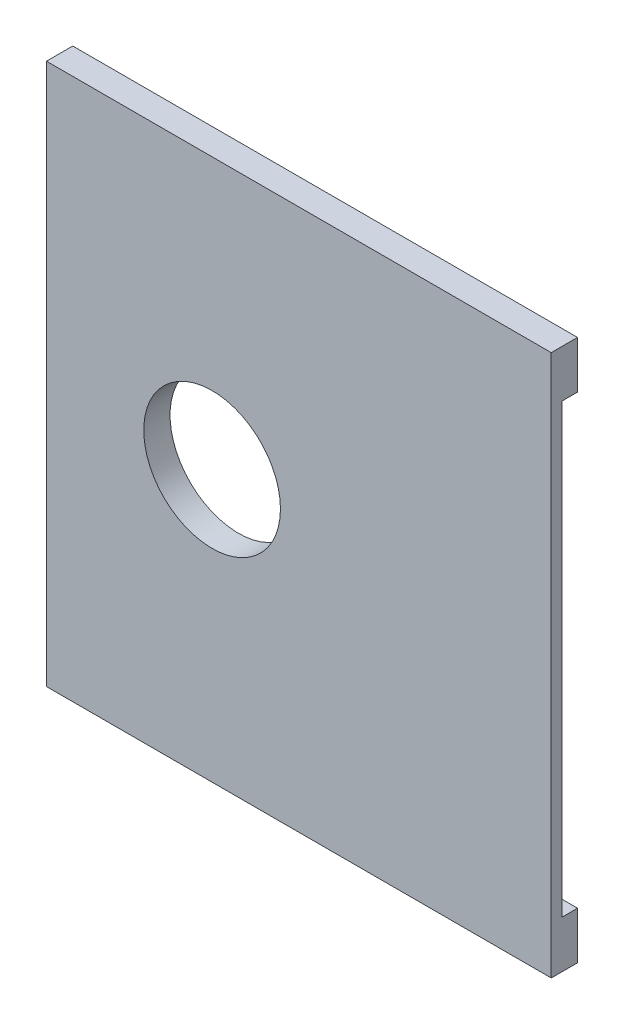
ISO-10303-21;
HEADER;
FILE_DESCRIPTION(('STEP AP214'),'2;1');
FILE_NAME('part.step','',(''),(''),'','','');
FILE_SCHEMA(('AUTOMOTIVE_DESIGN { 1 0 10303 214 1 1 1 1 }'));
ENDSEC;
DATA;
#1=APPLICATION_CONTEXT('core data for automotive mechanical design processes');
#2=APPLICATION_PROTOCOL_DEFINITION('international standard','automotive_design',2000,#1);
#3=PRODUCT_CONTEXT('',#1,'mechanical');
#4=PRODUCT('Part','Part','',(#3));
#5=PRODUCT_RELATED_PRODUCT_CATEGORY('part','',(#4));
#6=PRODUCT_DEFINITION_FORMATION('','',#4);
#7=PRODUCT_DEFINITION_CONTEXT('part definition',#1,'design');
#8=PRODUCT_DEFINITION('design','',#6,#7);
#9=PRODUCT_DEFINITION_SHAPE('','',#8);
#10=(LENGTH_UNIT() NAMED_UNIT(*) SI_UNIT(.MILLI.,.METRE.));
#11=(NAMED_UNIT(*) PLANE_ANGLE_UNIT() SI_UNIT($,.RADIAN.));
#12=(NAMED_UNIT(*) SI_UNIT($,.STERADIAN.) SOLID_ANGLE_UNIT());
#13=UNCERTAINTY_MEASURE_WITH_UNIT(LENGTH_MEASURE(1.E-05),#10,'distance_accuracy_value','');
#14=(GEOMETRIC_REPRESENTATION_CONTEXT(3) GLOBAL_UNCERTAINTY_ASSIGNED_CONTEXT((#13)) GLOBAL_UNIT_ASSIGNED_CONTEXT((#10,
#11,#12)) REPRESENTATION_CONTEXT('',''));
#15=CARTESIAN_POINT('',(0.,0.,0.));
#16=DIRECTION('',(0.,0.,1.));
#17=DIRECTION('',(1.,0.,0.));
#18=AXIS2_PLACEMENT_3D('',#15,#16,#17);
#19=CARTESIAN_POINT('',(0.,0.,0.));
#20=DIRECTION('',(0.,0.,1.));
#21=DIRECTION('',(1.,0.,0.));
#22=AXIS2_PLACEMENT_3D('',#19,#20,#21);
#23=PLANE('',#22);
#24=CARTESIAN_POINT('',(0.,0.,0.));
#25=DIRECTION('',(0.,0.,1.));
#26=DIRECTION('',(1.,0.,0.));
#27=AXIS2_PLACEMENT_3D('',#24,#25,#26);
#28=CIRCLE('',#27,2.6);
#29=CARTESIAN_POINT('',(2.6,0.,0.));
#30=VERTEX_POINT('',#29);
#31=EDGE_CURVE('E125',#30,#30,#28,.T.);
#32=ORIENTED_EDGE('',*,*,#31,.T.);
#33=EDGE_LOOP('',(#32));
#34=FACE_BOUND('',#33,.T.);
#35=DIRECTION('',(1.,0.,0.));
#36=VECTOR('',#35,1.);
#37=CARTESIAN_POINT('',(12.9,-8.49999999999999,0.));
#38=LINE('',#37,#36);
#39=CARTESIAN_POINT('',(5.30000000000001,-8.49999999999999,0.));
#40=VERTEX_POINT('',#39);
#41=CARTESIAN_POINT('',(12.9,-8.49999999999999,0.));
#42=VERTEX_POINT('',#41);
#43=EDGE_CURVE('E170',#40,#42,#38,.T.);
#44=ORIENTED_EDGE('',*,*,#43,.T.);
#45=DIRECTION('',(0.,1.,0.));
#46=VECTOR('',#45,1.);
#47=CARTESIAN_POINT('',(12.9,-10.3,0.));
#48=LINE('',#47,#46);
#49=CARTESIAN_POINT('',(12.9,-10.3,0.));
#50=VERTEX_POINT('',#49);
#51=EDGE_CURVE('E151',#50,#42,#48,.T.);
#52=ORIENTED_EDGE('',*,*,#51,.F.);
#53=DIRECTION('',(1.,0.,0.));
#54=VECTOR('',#53,1.);
#55=CARTESIAN_POINT('',(8.1,-10.3,0.));
#56=LINE('',#55,#54);
#57=CARTESIAN_POINT('',(-6.3,-10.3,0.));
#58=VERTEX_POINT('',#57);
#59=EDGE_CURVE('E149',#58,#50,#56,.T.);
#60=ORIENTED_EDGE('',*,*,#59,.F.);
#61=DIRECTION('',(0.,-1.,0.));
#62=VECTOR('',#61,1.);
#63=CARTESIAN_POINT('',(-6.3,10.3,0.));
#64=LINE('',#63,#62);
#65=CARTESIAN_POINT('',(-6.3,10.3,0.));
#66=VERTEX_POINT('',#65);
#67=EDGE_CURVE('E136',#66,#58,#64,.T.);
#68=ORIENTED_EDGE('',*,*,#67,.F.);
#69=DIRECTION('',(-1.,0.,0.));
#70=VECTOR('',#69,1.);
#71=CARTESIAN_POINT('',(6.30000000000001,10.3,0.));
#72=LINE('',#71,#70);
#73=CARTESIAN_POINT('',(12.9,10.3,0.));
#74=VERTEX_POINT('',#73);
#75=EDGE_CURVE('E140',#74,#66,#72,.T.);
#76=ORIENTED_EDGE('',*,*,#75,.F.);
#77=CARTESIAN_POINT('',(12.9,8.5,0.));
#78=VERTEX_POINT('',#77);
#79=EDGE_CURVE('E79',#78,#74,#48,.T.);
#80=ORIENTED_EDGE('',*,*,#79,.F.);
#81=DIRECTION('',(-1.,0.,0.));
#82=VECTOR('',#81,1.);
#83=CARTESIAN_POINT('',(6.30000000000001,8.49999999999999,0.));
#84=LINE('',#83,#82);
#85=CARTESIAN_POINT('',(5.30000000000001,8.49999999999999,0.));
#86=VERTEX_POINT('',#85);
#87=EDGE_CURVE('E120',#78,#86,#84,.T.);
#88=ORIENTED_EDGE('',*,*,#87,.T.);
#89=DIRECTION('',(0.,-1.,0.));
#90=VECTOR('',#89,1.);
#91=CARTESIAN_POINT('',(5.30000000000001,8.49999999999999,0.));
#92=LINE('',#91,#90);
#93=EDGE_CURVE('E124',#86,#40,#92,.T.);
#94=ORIENTED_EDGE('',*,*,#93,.T.);
#95=EDGE_LOOP('',(#44,#52,#60,#68,#76,#80,#88,#94));
#96=FACE_BOUND('',#95,.T.);
#97=ADVANCED_FACE('F33',(#34,#96),#23,.F.);
#98=CARTESIAN_POINT('',(12.9,-10.3,1.));
#99=DIRECTION('',(-1.,0.,0.));
#100=DIRECTION('',(0.,0.,1.));
#101=AXIS2_PLACEMENT_3D('',#98,#99,#100);
#102=PLANE('',#101);
#103=DIRECTION('',(0.,0.,-1.));
#104=VECTOR('',#103,1.);
#105=CARTESIAN_POINT('',(12.9,-8.49999999999999,0.6));
#106=LINE('',#105,#104);
#107=CARTESIAN_POINT('',(12.9,-8.49999999999999,0.6));
#108=VERTEX_POINT('',#107);
#109=EDGE_CURVE('E131',#108,#42,#106,.T.);
#110=ORIENTED_EDGE('',*,*,#109,.F.);
#111=DIRECTION('',(0.,1.,0.));
#112=VECTOR('',#111,1.);
#113=CARTESIAN_POINT('',(12.9,8.5,0.6));
#114=LINE('',#113,#112);
#115=CARTESIAN_POINT('',(12.9,8.49999999999999,0.6));
#116=VERTEX_POINT('',#115);
#117=EDGE_CURVE('E260',#108,#116,#114,.T.);
#118=ORIENTED_EDGE('',*,*,#117,.T.);
#119=DIRECTION('',(0.,0.,-1.));
#120=VECTOR('',#119,1.);
#121=CARTESIAN_POINT('',(12.9,8.5,0.6));
#122=LINE('',#121,#120);
#123=EDGE_CURVE('E48',#116,#78,#122,.T.);
#124=ORIENTED_EDGE('',*,*,#123,.T.);
#125=ORIENTED_EDGE('',*,*,#79,.T.);
#126=DIRECTION('',(0.,0.,-1.));
#127=VECTOR('',#126,1.);
#128=CARTESIAN_POINT('',(12.9,10.3,1.));
#129=LINE('',#128,#127);
#130=CARTESIAN_POINT('',(12.9,10.3,1.));
#131=VERTEX_POINT('',#130);
#132=EDGE_CURVE('E146',#131,#74,#129,.T.);
#133=ORIENTED_EDGE('',*,*,#132,.F.);
#134=DIRECTION('',(0.,1.,0.));
#135=VECTOR('',#134,1.);
#136=CARTESIAN_POINT('',(12.9,-10.3,1.));
#137=LINE('',#136,#135);
#138=CARTESIAN_POINT('',(12.9,-10.3,1.));
#139=VERTEX_POINT('',#138);
#140=EDGE_CURVE('E144',#139,#131,#137,.T.);
#141=ORIENTED_EDGE('',*,*,#140,.F.);
#142=DIRECTION('',(0.,0.,-1.));
#143=VECTOR('',#142,1.);
#144=CARTESIAN_POINT('',(12.9,-10.3,1.));
#145=LINE('',#144,#143);
#146=EDGE_CURVE('E156',#139,#50,#145,.T.);
#147=ORIENTED_EDGE('',*,*,#146,.T.);
#148=ORIENTED_EDGE('',*,*,#51,.T.);
#149=EDGE_LOOP('',(#110,#118,#124,#125,#133,#141,#147,#148));
#150=FACE_BOUND('',#149,.T.);
#151=ADVANCED_FACE('F172',(#150),#102,.F.);
#152=CARTESIAN_POINT('',(0.,0.,1.));
#153=DIRECTION('',(0.,0.,1.));
#154=DIRECTION('',(1.,0.,0.));
#155=AXIS2_PLACEMENT_3D('',#152,#153,#154);
#156=PLANE('',#155);
#157=DIRECTION('',(-1.,0.,0.));
#158=VECTOR('',#157,1.);
#159=CARTESIAN_POINT('',(-5.30000000000001,10.3,1.));
#160=LINE('',#159,#158);
#161=CARTESIAN_POINT('',(-6.3,10.3,1.));
#162=VERTEX_POINT('',#161);
#163=EDGE_CURVE('E57',#131,#162,#160,.T.);
#164=ORIENTED_EDGE('',*,*,#163,.T.);
#165=DIRECTION('',(0.,-1.,0.));
#166=VECTOR('',#165,1.);
#167=CARTESIAN_POINT('',(-6.3,10.3,1.));
#168=LINE('',#167,#166);
#169=CARTESIAN_POINT('',(-6.3,-10.3,1.));
#170=VERTEX_POINT('',#169);
#171=EDGE_CURVE('E139',#162,#170,#168,.T.);
#172=ORIENTED_EDGE('',*,*,#171,.T.);
#173=DIRECTION('',(1.,0.,0.));
#174=VECTOR('',#173,1.);
#175=CARTESIAN_POINT('',(-6.3,-10.3,1.));
#176=LINE('',#175,#174);
#177=EDGE_CURVE('E142',#170,#139,#176,.T.);
#178=ORIENTED_EDGE('',*,*,#177,.T.);
#179=ORIENTED_EDGE('',*,*,#140,.T.);
#180=EDGE_LOOP('',(#164,#172,#178,#179));
#181=FACE_BOUND('',#180,.T.);
#182=CARTESIAN_POINT('',(0.,0.,1.));
#183=DIRECTION('',(0.,0.,1.));
#184=DIRECTION('',(1.,0.,0.));
#185=AXIS2_PLACEMENT_3D('',#182,#183,#184);
#186=CIRCLE('',#185,2.6);
#187=CARTESIAN_POINT('',(2.6,0.,1.));
#188=VERTEX_POINT('',#187);
#189=EDGE_CURVE('E129',#188,#188,#186,.T.);
#190=ORIENTED_EDGE('',*,*,#189,.F.);
#191=EDGE_LOOP('',(#190));
#192=FACE_BOUND('',#191,.T.);
#193=ADVANCED_FACE('F174',(#181,#192),#156,.T.);
#194=CARTESIAN_POINT('',(-6.3,10.3,1.));
#195=DIRECTION('',(1.,0.,0.));
#196=DIRECTION('',(0.,1.,0.));
#197=AXIS2_PLACEMENT_3D('',#194,#195,#196);
#198=PLANE('',#197);
#199=ORIENTED_EDGE('',*,*,#67,.T.);
#200=DIRECTION('',(0.,0.,-1.));
#201=VECTOR('',#200,1.);
#202=CARTESIAN_POINT('',(-6.3,-10.3,1.));
#203=LINE('',#202,#201);
#204=EDGE_CURVE('E41',#170,#58,#203,.T.);
#205=ORIENTED_EDGE('',*,*,#204,.F.);
#206=ORIENTED_EDGE('',*,*,#171,.F.);
#207=DIRECTION('',(0.,0.,-1.));
#208=VECTOR('',#207,1.);
#209=CARTESIAN_POINT('',(-6.3,10.3,1.));
#210=LINE('',#209,#208);
#211=EDGE_CURVE('E11',#162,#66,#210,.T.);
#212=ORIENTED_EDGE('',*,*,#211,.T.);
#213=EDGE_LOOP('',(#199,#205,#206,#212));
#214=FACE_BOUND('',#213,.T.);
#215=ADVANCED_FACE('F35',(#214),#198,.F.);
#216=CARTESIAN_POINT('',(8.1,-10.3,1.));
#217=DIRECTION('',(0.,1.,0.));
#218=DIRECTION('',(0.,0.,1.));
#219=AXIS2_PLACEMENT_3D('',#216,#217,#218);
#220=PLANE('',#219);
#221=ORIENTED_EDGE('',*,*,#59,.T.);
#222=ORIENTED_EDGE('',*,*,#146,.F.);
#223=ORIENTED_EDGE('',*,*,#177,.F.);
#224=ORIENTED_EDGE('',*,*,#204,.T.);
#225=EDGE_LOOP('',(#221,#222,#223,#224));
#226=FACE_BOUND('',#225,.T.);
#227=ADVANCED_FACE('F162',(#226),#220,.F.);
#228=CARTESIAN_POINT('',(6.30000000000001,10.3,1.));
#229=DIRECTION('',(0.,-1.,0.));
#230=DIRECTION('',(0.,0.,-1.));
#231=AXIS2_PLACEMENT_3D('',#228,#229,#230);
#232=PLANE('',#231);
#233=ORIENTED_EDGE('',*,*,#75,.T.);
#234=ORIENTED_EDGE('',*,*,#211,.F.);
#235=ORIENTED_EDGE('',*,*,#163,.F.);
#236=ORIENTED_EDGE('',*,*,#132,.T.);
#237=EDGE_LOOP('',(#233,#234,#235,#236));
#238=FACE_BOUND('',#237,.T.);
#239=ADVANCED_FACE('F183',(#238),#232,.F.);
#240=CARTESIAN_POINT('',(0.,0.,1.));
#241=DIRECTION('',(0.,0.,-1.));
#242=DIRECTION('',(-1.,0.,0.));
#243=AXIS2_PLACEMENT_3D('',#240,#241,#242);
#244=CYLINDRICAL_SURFACE('',#243,2.6);
#245=ORIENTED_EDGE('',*,*,#189,.T.);
#246=EDGE_LOOP('',(#245));
#247=FACE_BOUND('',#246,.T.);
#248=ORIENTED_EDGE('',*,*,#31,.F.);
#249=EDGE_LOOP('',(#248));
#250=FACE_BOUND('',#249,.T.);
#251=ADVANCED_FACE('F180',(#247,#250),#244,.F.);
#252=CARTESIAN_POINT('',(5.30000000000001,8.49999999999999,0.6));
#253=DIRECTION('',(1.,0.,0.));
#254=DIRECTION('',(0.,1.,0.));
#255=AXIS2_PLACEMENT_3D('',#252,#253,#254);
#256=PLANE('',#255);
#257=ORIENTED_EDGE('',*,*,#93,.F.);
#258=DIRECTION('',(0.,0.,-1.));
#259=VECTOR('',#258,1.);
#260=CARTESIAN_POINT('',(5.30000000000001,8.49999999999999,0.6));
#261=LINE('',#260,#259);
#262=CARTESIAN_POINT('',(5.30000000000001,8.49999999999999,0.6));
#263=VERTEX_POINT('',#262);
#264=EDGE_CURVE('E118',#263,#86,#261,.T.);
#265=ORIENTED_EDGE('',*,*,#264,.F.);
#266=DIRECTION('',(0.,-1.,0.));
#267=VECTOR('',#266,1.);
#268=CARTESIAN_POINT('',(5.30000000000001,8.49999999999999,0.6));
#269=LINE('',#268,#267);
#270=CARTESIAN_POINT('',(5.30000000000001,-8.49999999999999,0.6));
#271=VERTEX_POINT('',#270);
#272=EDGE_CURVE('E105',#263,#271,#269,.T.);
#273=ORIENTED_EDGE('',*,*,#272,.T.);
#274=DIRECTION('',(0.,0.,-1.));
#275=VECTOR('',#274,1.);
#276=CARTESIAN_POINT('',(5.30000000000001,-8.49999999999999,0.6));
#277=LINE('',#276,#275);
#278=EDGE_CURVE('E126',#271,#40,#277,.T.);
#279=ORIENTED_EDGE('',*,*,#278,.T.);
#280=EDGE_LOOP('',(#257,#265,#273,#279));
#281=FACE_BOUND('',#280,.T.);
#282=ADVANCED_FACE('F122',(#281),#256,.T.);
#283=CARTESIAN_POINT('',(12.9,-8.49999999999999,0.6));
#284=DIRECTION('',(0.,1.,0.));
#285=DIRECTION('',(-1.,0.,0.));
#286=AXIS2_PLACEMENT_3D('',#283,#284,#285);
#287=PLANE('',#286);
#288=ORIENTED_EDGE('',*,*,#43,.F.);
#289=ORIENTED_EDGE('',*,*,#278,.F.);
#290=DIRECTION('',(1.,0.,0.));
#291=VECTOR('',#290,1.);
#292=CARTESIAN_POINT('',(5.30000000000001,-8.49999999999999,0.6));
#293=LINE('',#292,#291);
#294=EDGE_CURVE('E110',#271,#108,#293,.T.);
#295=ORIENTED_EDGE('',*,*,#294,.T.);
#296=ORIENTED_EDGE('',*,*,#109,.T.);
#297=EDGE_LOOP('',(#288,#289,#295,#296));
#298=FACE_BOUND('',#297,.T.);
#299=ADVANCED_FACE('F222',(#298),#287,.T.);
#300=CARTESIAN_POINT('',(6.30000000000001,8.49999999999999,0.6));
#301=DIRECTION('',(0.,-1.,0.));
#302=DIRECTION('',(1.,0.,0.));
#303=AXIS2_PLACEMENT_3D('',#300,#301,#302);
#304=PLANE('',#303);
#305=ORIENTED_EDGE('',*,*,#87,.F.);
#306=ORIENTED_EDGE('',*,*,#123,.F.);
#307=DIRECTION('',(-1.,0.,0.));
#308=VECTOR('',#307,1.);
#309=CARTESIAN_POINT('',(5.30000000000001,8.49999999999999,0.6));
#310=LINE('',#309,#308);
#311=EDGE_CURVE('E108',#116,#263,#310,.T.);
#312=ORIENTED_EDGE('',*,*,#311,.T.);
#313=ORIENTED_EDGE('',*,*,#264,.T.);
#314=EDGE_LOOP('',(#305,#306,#312,#313));
#315=FACE_BOUND('',#314,.T.);
#316=ADVANCED_FACE('F117',(#315),#304,.T.);
#317=CARTESIAN_POINT('',(0.,0.,0.6));
#318=DIRECTION('',(0.,0.,-1.));
#319=DIRECTION('',(-1.,0.,0.));
#320=AXIS2_PLACEMENT_3D('',#317,#318,#319);
#321=PLANE('',#320);
#322=ORIENTED_EDGE('',*,*,#311,.F.);
#323=ORIENTED_EDGE('',*,*,#117,.F.);
#324=ORIENTED_EDGE('',*,*,#294,.F.);
#325=ORIENTED_EDGE('',*,*,#272,.F.);
#326=EDGE_LOOP('',(#322,#323,#324,#325));
#327=FACE_BOUND('',#326,.T.);
#328=ADVANCED_FACE('F106',(#327),#321,.T.);
#329=CLOSED_SHELL('',(#97,#151,#193,#215,#227,#239,#251,#282,#299,#316,#328));
#330=MANIFOLD_SOLID_BREP('B2',#329);
#331=ADVANCED_BREP_SHAPE_REPRESENTATION('',(#18,#330),#14);
#332=SHAPE_DEFINITION_REPRESENTATION(#9,#331);
ENDSEC;
END-ISO-10303-21;
